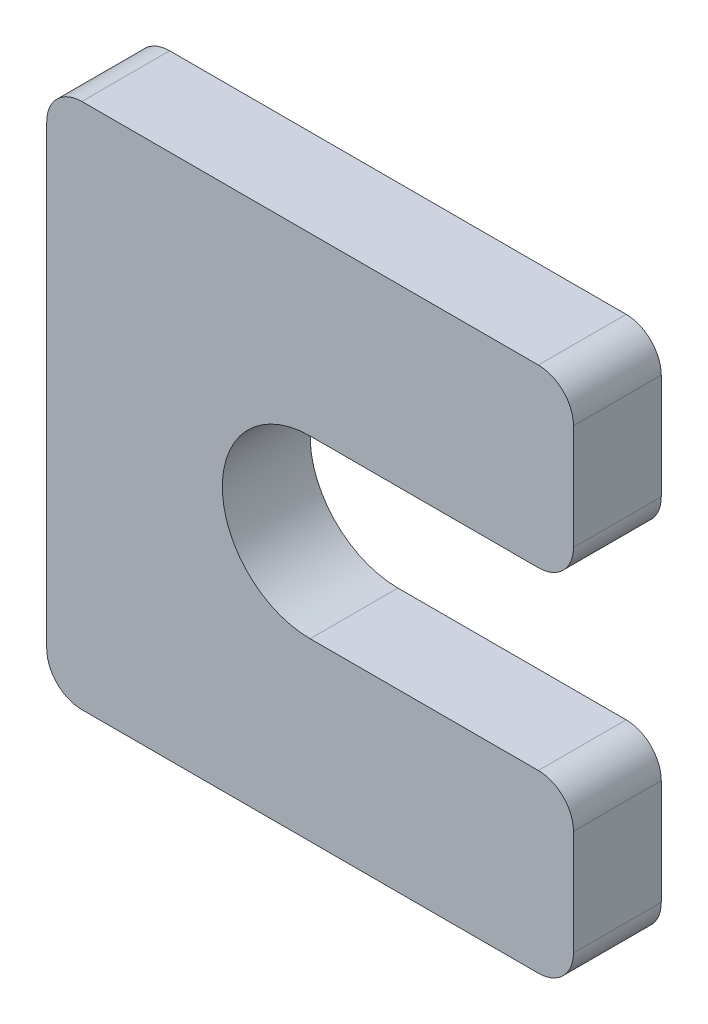
ISO-10303-21;
HEADER;
FILE_DESCRIPTION(('STEP AP214'),'2;1');
FILE_NAME('part.step','',(''),(''),'','','');
FILE_SCHEMA(('AUTOMOTIVE_DESIGN { 1 0 10303 214 1 1 1 1 }'));
ENDSEC;
DATA;
#1=APPLICATION_CONTEXT('core data for automotive mechanical design processes');
#2=APPLICATION_PROTOCOL_DEFINITION('international standard','automotive_design',2000,#1);
#3=PRODUCT_CONTEXT('',#1,'mechanical');
#4=PRODUCT('Part','Part','',(#3));
#5=PRODUCT_RELATED_PRODUCT_CATEGORY('part','',(#4));
#6=PRODUCT_DEFINITION_FORMATION('','',#4);
#7=PRODUCT_DEFINITION_CONTEXT('part definition',#1,'design');
#8=PRODUCT_DEFINITION('design','',#6,#7);
#9=PRODUCT_DEFINITION_SHAPE('','',#8);
#10=(LENGTH_UNIT() NAMED_UNIT(*) SI_UNIT(.MILLI.,.METRE.));
#11=(NAMED_UNIT(*) PLANE_ANGLE_UNIT() SI_UNIT($,.RADIAN.));
#12=(NAMED_UNIT(*) SI_UNIT($,.STERADIAN.) SOLID_ANGLE_UNIT());
#13=UNCERTAINTY_MEASURE_WITH_UNIT(LENGTH_MEASURE(1.E-05),#10,'distance_accuracy_value','');
#14=(GEOMETRIC_REPRESENTATION_CONTEXT(3) GLOBAL_UNCERTAINTY_ASSIGNED_CONTEXT((#13)) GLOBAL_UNIT_ASSIGNED_CONTEXT((#10,
#11,#12)) REPRESENTATION_CONTEXT('',''));
#15=CARTESIAN_POINT('',(0.,0.,0.));
#16=DIRECTION('',(0.,0.,1.));
#17=DIRECTION('',(1.,0.,0.));
#18=AXIS2_PLACEMENT_3D('',#15,#16,#17);
#19=CARTESIAN_POINT('',(30.,0.,5.));
#20=DIRECTION('',(-1.,0.,0.));
#21=DIRECTION('',(0.,0.,1.));
#22=AXIS2_PLACEMENT_3D('',#19,#20,#21);
#23=PLANE('',#22);
#24=DIRECTION('',(0.,1.,0.));
#25=VECTOR('',#24,1.);
#26=CARTESIAN_POINT('',(30.,0.,5.));
#27=LINE('',#26,#25);
#28=CARTESIAN_POINT('',(30.,22.,5.));
#29=VERTEX_POINT('',#28);
#30=CARTESIAN_POINT('',(30.,28.,5.));
#31=VERTEX_POINT('',#30);
#32=EDGE_CURVE('E175',#29,#31,#27,.T.);
#33=ORIENTED_EDGE('',*,*,#32,.F.);
#34=DIRECTION('',(0.,0.,1.));
#35=VECTOR('',#34,1.);
#36=CARTESIAN_POINT('',(30.,22.,5.));
#37=LINE('',#36,#35);
#38=CARTESIAN_POINT('',(30.,22.,0.));
#39=VERTEX_POINT('',#38);
#40=EDGE_CURVE('E55',#29,#39,#37,.F.);
#41=ORIENTED_EDGE('',*,*,#40,.T.);
#42=DIRECTION('',(0.,1.,0.));
#43=VECTOR('',#42,1.);
#44=CARTESIAN_POINT('',(30.,0.,0.));
#45=LINE('',#44,#43);
#46=CARTESIAN_POINT('',(30.,28.,0.));
#47=VERTEX_POINT('',#46);
#48=EDGE_CURVE('E188',#39,#47,#45,.T.);
#49=ORIENTED_EDGE('',*,*,#48,.T.);
#50=DIRECTION('',(0.,0.,-1.));
#51=VECTOR('',#50,1.);
#52=CARTESIAN_POINT('',(30.,28.,5.));
#53=LINE('',#52,#51);
#54=EDGE_CURVE('E223',#47,#31,#53,.F.);
#55=ORIENTED_EDGE('',*,*,#54,.T.);
#56=EDGE_LOOP('',(#33,#41,#49,#55));
#57=FACE_BOUND('',#56,.T.);
#58=ADVANCED_FACE('F33',(#57),#23,.F.);
#59=CARTESIAN_POINT('',(15.,15.,0.));
#60=DIRECTION('',(0.,0.,1.));
#61=DIRECTION('',(1.,0.,0.));
#62=AXIS2_PLACEMENT_3D('',#59,#60,#61);
#63=CYLINDRICAL_SURFACE('',#62,5.);
#64=DIRECTION('',(0.,0.,1.));
#65=VECTOR('',#64,1.);
#66=CARTESIAN_POINT('',(15.,20.,0.));
#67=LINE('',#66,#65);
#68=CARTESIAN_POINT('',(15.,20.,0.));
#69=VERTEX_POINT('',#68);
#70=CARTESIAN_POINT('',(15.,20.,5.00001125));
#71=VERTEX_POINT('',#70);
#72=EDGE_CURVE('E148',#69,#71,#67,.T.);
#73=ORIENTED_EDGE('',*,*,#72,.T.);
#74=CARTESIAN_POINT('',(15.,15.,5.));
#75=DIRECTION('',(0.,0.,-1.));
#76=DIRECTION('',(-1.,0.,0.));
#77=AXIS2_PLACEMENT_3D('',#74,#75,#76);
#78=CIRCLE('',#77,5.);
#79=CARTESIAN_POINT('',(15.,10.,5.00001125));
#80=VERTEX_POINT('',#79);
#81=EDGE_CURVE('E160',#80,#71,#78,.T.);
#82=ORIENTED_EDGE('',*,*,#81,.F.);
#83=DIRECTION('',(0.,0.,1.));
#84=VECTOR('',#83,1.);
#85=CARTESIAN_POINT('',(15.,10.,0.));
#86=LINE('',#85,#84);
#87=CARTESIAN_POINT('',(15.,10.,0.));
#88=VERTEX_POINT('',#87);
#89=EDGE_CURVE('E144',#88,#80,#86,.T.);
#90=ORIENTED_EDGE('',*,*,#89,.F.);
#91=CARTESIAN_POINT('',(15.,15.,0.));
#92=DIRECTION('',(0.,0.,1.));
#93=DIRECTION('',(1.,0.,0.));
#94=AXIS2_PLACEMENT_3D('',#91,#92,#93);
#95=CIRCLE('',#94,5.);
#96=EDGE_CURVE('E138',#69,#88,#95,.T.);
#97=ORIENTED_EDGE('',*,*,#96,.F.);
#98=EDGE_LOOP('',(#73,#82,#90,#97));
#99=FACE_BOUND('',#98,.T.);
#100=ADVANCED_FACE('F158',(#99),#63,.F.);
#101=CARTESIAN_POINT('',(0.,0.,5.));
#102=DIRECTION('',(1.,0.,0.));
#103=DIRECTION('',(0.,0.,-1.));
#104=AXIS2_PLACEMENT_3D('',#101,#102,#103);
#105=PLANE('',#104);
#106=DIRECTION('',(0.,-1.,0.));
#107=VECTOR('',#106,1.);
#108=CARTESIAN_POINT('',(0.,0.,0.));
#109=LINE('',#108,#107);
#110=CARTESIAN_POINT('',(0.,28.,0.));
#111=VERTEX_POINT('',#110);
#112=CARTESIAN_POINT('',(0.,2.,0.));
#113=VERTEX_POINT('',#112);
#114=EDGE_CURVE('E162',#111,#113,#109,.T.);
#115=ORIENTED_EDGE('',*,*,#114,.T.);
#116=DIRECTION('',(0.,0.,-1.));
#117=VECTOR('',#116,1.);
#118=CARTESIAN_POINT('',(0.,2.,5.));
#119=LINE('',#118,#117);
#120=CARTESIAN_POINT('',(0.,2.,5.));
#121=VERTEX_POINT('',#120);
#122=EDGE_CURVE('E11',#113,#121,#119,.F.);
#123=ORIENTED_EDGE('',*,*,#122,.T.);
#124=DIRECTION('',(0.,-1.,0.));
#125=VECTOR('',#124,1.);
#126=CARTESIAN_POINT('',(0.,0.,5.));
#127=LINE('',#126,#125);
#128=CARTESIAN_POINT('',(0.,28.,5.));
#129=VERTEX_POINT('',#128);
#130=EDGE_CURVE('E168',#129,#121,#127,.T.);
#131=ORIENTED_EDGE('',*,*,#130,.F.);
#132=DIRECTION('',(0.,0.,-1.));
#133=VECTOR('',#132,1.);
#134=CARTESIAN_POINT('',(0.,28.,5.));
#135=LINE('',#134,#133);
#136=EDGE_CURVE('E41',#129,#111,#135,.T.);
#137=ORIENTED_EDGE('',*,*,#136,.T.);
#138=EDGE_LOOP('',(#115,#123,#131,#137));
#139=FACE_BOUND('',#138,.T.);
#140=ADVANCED_FACE('F244',(#139),#105,.F.);
#141=CARTESIAN_POINT('',(0.,0.,5.));
#142=DIRECTION('',(0.,1.,0.));
#143=DIRECTION('',(0.,0.,1.));
#144=AXIS2_PLACEMENT_3D('',#141,#142,#143);
#145=PLANE('',#144);
#146=DIRECTION('',(1.,0.,0.));
#147=VECTOR('',#146,1.);
#148=CARTESIAN_POINT('',(0.,0.,0.));
#149=LINE('',#148,#147);
#150=CARTESIAN_POINT('',(2.,0.,0.));
#151=VERTEX_POINT('',#150);
#152=CARTESIAN_POINT('',(28.,0.,0.));
#153=VERTEX_POINT('',#152);
#154=EDGE_CURVE('E185',#151,#153,#149,.T.);
#155=ORIENTED_EDGE('',*,*,#154,.T.);
#156=DIRECTION('',(0.,0.,-1.));
#157=VECTOR('',#156,1.);
#158=CARTESIAN_POINT('',(28.,0.,5.));
#159=LINE('',#158,#157);
#160=CARTESIAN_POINT('',(28.,0.,5.));
#161=VERTEX_POINT('',#160);
#162=EDGE_CURVE('E238',#153,#161,#159,.F.);
#163=ORIENTED_EDGE('',*,*,#162,.T.);
#164=DIRECTION('',(1.,0.,0.));
#165=VECTOR('',#164,1.);
#166=CARTESIAN_POINT('',(0.,0.,5.));
#167=LINE('',#166,#165);
#168=CARTESIAN_POINT('',(2.,0.,5.));
#169=VERTEX_POINT('',#168);
#170=EDGE_CURVE('E171',#169,#161,#167,.T.);
#171=ORIENTED_EDGE('',*,*,#170,.F.);
#172=DIRECTION('',(0.,0.,-1.));
#173=VECTOR('',#172,1.);
#174=CARTESIAN_POINT('',(2.,0.,5.));
#175=LINE('',#174,#173);
#176=EDGE_CURVE('E235',#169,#151,#175,.T.);
#177=ORIENTED_EDGE('',*,*,#176,.T.);
#178=EDGE_LOOP('',(#155,#163,#171,#177));
#179=FACE_BOUND('',#178,.T.);
#180=ADVANCED_FACE('F302',(#179),#145,.F.);
#181=CARTESIAN_POINT('',(30.,2.,0.));
#182=VERTEX_POINT('',#181);
#183=CARTESIAN_POINT('',(30.,8.,0.));
#184=VERTEX_POINT('',#183);
#185=EDGE_CURVE('E190',#182,#184,#45,.T.);
#186=ORIENTED_EDGE('',*,*,#185,.T.);
#187=DIRECTION('',(0.,0.,1.));
#188=VECTOR('',#187,1.);
#189=CARTESIAN_POINT('',(30.,8.,5.));
#190=LINE('',#189,#188);
#191=CARTESIAN_POINT('',(30.,8.,5.));
#192=VERTEX_POINT('',#191);
#193=EDGE_CURVE('E197',#184,#192,#190,.T.);
#194=ORIENTED_EDGE('',*,*,#193,.T.);
#195=CARTESIAN_POINT('',(30.,2.,5.));
#196=VERTEX_POINT('',#195);
#197=EDGE_CURVE('E178',#196,#192,#27,.T.);
#198=ORIENTED_EDGE('',*,*,#197,.F.);
#199=DIRECTION('',(0.,0.,-1.));
#200=VECTOR('',#199,1.);
#201=CARTESIAN_POINT('',(30.,2.,5.));
#202=LINE('',#201,#200);
#203=EDGE_CURVE('E182',#196,#182,#202,.T.);
#204=ORIENTED_EDGE('',*,*,#203,.T.);
#205=EDGE_LOOP('',(#186,#194,#198,#204));
#206=FACE_BOUND('',#205,.T.);
#207=ADVANCED_FACE('F294',(#206),#23,.F.);
#208=CARTESIAN_POINT('',(0.,30.,5.));
#209=DIRECTION('',(0.,-1.,0.));
#210=DIRECTION('',(0.,0.,-1.));
#211=AXIS2_PLACEMENT_3D('',#208,#209,#210);
#212=PLANE('',#211);
#213=DIRECTION('',(-1.,0.,0.));
#214=VECTOR('',#213,1.);
#215=CARTESIAN_POINT('',(0.,30.,5.));
#216=LINE('',#215,#214);
#217=CARTESIAN_POINT('',(28.,30.,5.));
#218=VERTEX_POINT('',#217);
#219=CARTESIAN_POINT('',(2.,30.,5.));
#220=VERTEX_POINT('',#219);
#221=EDGE_CURVE('E179',#218,#220,#216,.T.);
#222=ORIENTED_EDGE('',*,*,#221,.F.);
#223=DIRECTION('',(0.,0.,-1.));
#224=VECTOR('',#223,1.);
#225=CARTESIAN_POINT('',(28.,30.,5.));
#226=LINE('',#225,#224);
#227=CARTESIAN_POINT('',(28.,30.,0.));
#228=VERTEX_POINT('',#227);
#229=EDGE_CURVE('E232',#218,#228,#226,.T.);
#230=ORIENTED_EDGE('',*,*,#229,.T.);
#231=DIRECTION('',(-1.,0.,0.));
#232=VECTOR('',#231,1.);
#233=CARTESIAN_POINT('',(0.,30.,0.));
#234=LINE('',#233,#232);
#235=CARTESIAN_POINT('',(2.,30.,0.));
#236=VERTEX_POINT('',#235);
#237=EDGE_CURVE('E172',#228,#236,#234,.T.);
#238=ORIENTED_EDGE('',*,*,#237,.T.);
#239=DIRECTION('',(0.,0.,-1.));
#240=VECTOR('',#239,1.);
#241=CARTESIAN_POINT('',(2.,30.,5.));
#242=LINE('',#241,#240);
#243=EDGE_CURVE('E230',#236,#220,#242,.F.);
#244=ORIENTED_EDGE('',*,*,#243,.T.);
#245=EDGE_LOOP('',(#222,#230,#238,#244));
#246=FACE_BOUND('',#245,.T.);
#247=ADVANCED_FACE('F275',(#246),#212,.F.);
#248=CARTESIAN_POINT('',(0.,0.,5.));
#249=DIRECTION('',(0.,0.,-1.));
#250=DIRECTION('',(-1.,0.,0.));
#251=AXIS2_PLACEMENT_3D('',#248,#249,#250);
#252=PLANE('',#251);
#253=ORIENTED_EDGE('',*,*,#197,.T.);
#254=CARTESIAN_POINT('',(28.,8.,5.));
#255=DIRECTION('',(0.,0.,-1.));
#256=DIRECTION('',(-1.,0.,0.));
#257=AXIS2_PLACEMENT_3D('',#254,#255,#256);
#258=CIRCLE('',#257,2.);
#259=CARTESIAN_POINT('',(28.,10.,5.));
#260=VERTEX_POINT('',#259);
#261=EDGE_CURVE('E259',#192,#260,#258,.F.);
#262=ORIENTED_EDGE('',*,*,#261,.T.);
#263=DIRECTION('',(-1.,0.,0.));
#264=VECTOR('',#263,1.);
#265=CARTESIAN_POINT('',(0.,10.,5.));
#266=LINE('',#265,#264);
#267=EDGE_CURVE('E155',#260,#80,#266,.T.);
#268=ORIENTED_EDGE('',*,*,#267,.T.);
#269=ORIENTED_EDGE('',*,*,#81,.T.);
#270=DIRECTION('',(1.,0.,0.));
#271=VECTOR('',#270,1.);
#272=CARTESIAN_POINT('',(0.,20.,5.));
#273=LINE('',#272,#271);
#274=CARTESIAN_POINT('',(28.,20.,5.));
#275=VERTEX_POINT('',#274);
#276=EDGE_CURVE('E151',#71,#275,#273,.T.);
#277=ORIENTED_EDGE('',*,*,#276,.T.);
#278=CARTESIAN_POINT('',(28.,22.,5.));
#279=DIRECTION('',(0.,0.,-1.));
#280=DIRECTION('',(-1.,0.,0.));
#281=AXIS2_PLACEMENT_3D('',#278,#279,#280);
#282=CIRCLE('',#281,2.);
#283=EDGE_CURVE('E261',#275,#29,#282,.F.);
#284=ORIENTED_EDGE('',*,*,#283,.T.);
#285=ORIENTED_EDGE('',*,*,#32,.T.);
#286=CARTESIAN_POINT('',(28.,28.,5.));
#287=DIRECTION('',(0.,0.,-1.));
#288=DIRECTION('',(-1.,0.,0.));
#289=AXIS2_PLACEMENT_3D('',#286,#287,#288);
#290=CIRCLE('',#289,2.);
#291=EDGE_CURVE('E263',#31,#218,#290,.F.);
#292=ORIENTED_EDGE('',*,*,#291,.T.);
#293=ORIENTED_EDGE('',*,*,#221,.T.);
#294=CARTESIAN_POINT('',(2.,28.,5.));
#295=DIRECTION('',(0.,0.,-1.));
#296=DIRECTION('',(-1.,0.,0.));
#297=AXIS2_PLACEMENT_3D('',#294,#295,#296);
#298=CIRCLE('',#297,2.);
#299=EDGE_CURVE('E200',#220,#129,#298,.F.);
#300=ORIENTED_EDGE('',*,*,#299,.T.);
#301=ORIENTED_EDGE('',*,*,#130,.T.);
#302=CARTESIAN_POINT('',(2.,2.,5.));
#303=DIRECTION('',(0.,0.,-1.));
#304=DIRECTION('',(-1.,0.,0.));
#305=AXIS2_PLACEMENT_3D('',#302,#303,#304);
#306=CIRCLE('',#305,2.);
#307=EDGE_CURVE('E266',#121,#169,#306,.F.);
#308=ORIENTED_EDGE('',*,*,#307,.T.);
#309=ORIENTED_EDGE('',*,*,#170,.T.);
#310=CARTESIAN_POINT('',(28.,2.,5.));
#311=DIRECTION('',(0.,0.,-1.));
#312=DIRECTION('',(-1.,0.,0.));
#313=AXIS2_PLACEMENT_3D('',#310,#311,#312);
#314=CIRCLE('',#313,2.);
#315=EDGE_CURVE('E265',#161,#196,#314,.F.);
#316=ORIENTED_EDGE('',*,*,#315,.T.);
#317=EDGE_LOOP('',(#253,#262,#268,#269,#277,#284,#285,#292,#293,#300,#301,#308,#309,#316));
#318=FACE_BOUND('',#317,.T.);
#319=ADVANCED_FACE('F271',(#318),#252,.F.);
#320=CARTESIAN_POINT('',(0.,0.,0.));
#321=DIRECTION('',(0.,0.,-1.));
#322=DIRECTION('',(-1.,0.,0.));
#323=AXIS2_PLACEMENT_3D('',#320,#321,#322);
#324=PLANE('',#323);
#325=DIRECTION('',(1.,0.,0.));
#326=VECTOR('',#325,1.);
#327=CARTESIAN_POINT('',(15.,10.,0.));
#328=LINE('',#327,#326);
#329=CARTESIAN_POINT('',(28.,10.,0.));
#330=VERTEX_POINT('',#329);
#331=EDGE_CURVE('E145',#88,#330,#328,.T.);
#332=ORIENTED_EDGE('',*,*,#331,.T.);
#333=CARTESIAN_POINT('',(28.,8.,0.));
#334=DIRECTION('',(0.,0.,-1.));
#335=DIRECTION('',(-1.,0.,0.));
#336=AXIS2_PLACEMENT_3D('',#333,#334,#335);
#337=CIRCLE('',#336,2.);
#338=EDGE_CURVE('E213',#330,#184,#337,.T.);
#339=ORIENTED_EDGE('',*,*,#338,.T.);
#340=ORIENTED_EDGE('',*,*,#185,.F.);
#341=CARTESIAN_POINT('',(28.,2.,0.));
#342=DIRECTION('',(0.,0.,-1.));
#343=DIRECTION('',(-1.,0.,0.));
#344=AXIS2_PLACEMENT_3D('',#341,#342,#343);
#345=CIRCLE('',#344,2.);
#346=EDGE_CURVE('E253',#182,#153,#345,.T.);
#347=ORIENTED_EDGE('',*,*,#346,.T.);
#348=ORIENTED_EDGE('',*,*,#154,.F.);
#349=CARTESIAN_POINT('',(2.,2.,0.));
#350=DIRECTION('',(0.,0.,-1.));
#351=DIRECTION('',(-1.,0.,0.));
#352=AXIS2_PLACEMENT_3D('',#349,#350,#351);
#353=CIRCLE('',#352,2.);
#354=EDGE_CURVE('E250',#151,#113,#353,.T.);
#355=ORIENTED_EDGE('',*,*,#354,.T.);
#356=ORIENTED_EDGE('',*,*,#114,.F.);
#357=CARTESIAN_POINT('',(2.,28.,0.));
#358=DIRECTION('',(0.,0.,-1.));
#359=DIRECTION('',(-1.,0.,0.));
#360=AXIS2_PLACEMENT_3D('',#357,#358,#359);
#361=CIRCLE('',#360,2.);
#362=EDGE_CURVE('E248',#111,#236,#361,.T.);
#363=ORIENTED_EDGE('',*,*,#362,.T.);
#364=ORIENTED_EDGE('',*,*,#237,.F.);
#365=CARTESIAN_POINT('',(28.,28.,0.));
#366=DIRECTION('',(0.,0.,-1.));
#367=DIRECTION('',(-1.,0.,0.));
#368=AXIS2_PLACEMENT_3D('',#365,#366,#367);
#369=CIRCLE('',#368,2.);
#370=EDGE_CURVE('E48',#228,#47,#369,.T.);
#371=ORIENTED_EDGE('',*,*,#370,.T.);
#372=ORIENTED_EDGE('',*,*,#48,.F.);
#373=CARTESIAN_POINT('',(28.,22.,0.));
#374=DIRECTION('',(0.,0.,-1.));
#375=DIRECTION('',(-1.,0.,0.));
#376=AXIS2_PLACEMENT_3D('',#373,#374,#375);
#377=CIRCLE('',#376,2.);
#378=CARTESIAN_POINT('',(28.,20.,0.));
#379=VERTEX_POINT('',#378);
#380=EDGE_CURVE('E140',#39,#379,#377,.T.);
#381=ORIENTED_EDGE('',*,*,#380,.T.);
#382=DIRECTION('',(-1.,0.,0.));
#383=VECTOR('',#382,1.);
#384=CARTESIAN_POINT('',(30.,20.,0.));
#385=LINE('',#384,#383);
#386=EDGE_CURVE('E133',#379,#69,#385,.T.);
#387=ORIENTED_EDGE('',*,*,#386,.T.);
#388=ORIENTED_EDGE('',*,*,#96,.T.);
#389=EDGE_LOOP('',(#332,#339,#340,#347,#348,#355,#356,#363,#364,#371,#372,#381,#387,#388));
#390=FACE_BOUND('',#389,.T.);
#391=ADVANCED_FACE('F136',(#390),#324,.T.);
#392=CARTESIAN_POINT('',(15.,10.,0.));
#393=DIRECTION('',(0.,-1.,0.));
#394=DIRECTION('',(0.,0.,-1.));
#395=AXIS2_PLACEMENT_3D('',#392,#393,#394);
#396=PLANE('',#395);
#397=ORIENTED_EDGE('',*,*,#267,.F.);
#398=DIRECTION('',(0.,0.,1.));
#399=VECTOR('',#398,1.);
#400=CARTESIAN_POINT('',(28.,10.,0.));
#401=LINE('',#400,#399);
#402=EDGE_CURVE('E220',#260,#330,#401,.F.);
#403=ORIENTED_EDGE('',*,*,#402,.T.);
#404=ORIENTED_EDGE('',*,*,#331,.F.);
#405=ORIENTED_EDGE('',*,*,#89,.T.);
#406=EDGE_LOOP('',(#397,#403,#404,#405));
#407=FACE_BOUND('',#406,.T.);
#408=ADVANCED_FACE('F346',(#407),#396,.F.);
#409=CARTESIAN_POINT('',(30.,20.,0.));
#410=DIRECTION('',(0.,1.,0.));
#411=DIRECTION('',(0.,0.,1.));
#412=AXIS2_PLACEMENT_3D('',#409,#410,#411);
#413=PLANE('',#412);
#414=ORIENTED_EDGE('',*,*,#386,.F.);
#415=DIRECTION('',(0.,0.,1.));
#416=VECTOR('',#415,1.);
#417=CARTESIAN_POINT('',(28.,20.,0.));
#418=LINE('',#417,#416);
#419=EDGE_CURVE('E221',#379,#275,#418,.T.);
#420=ORIENTED_EDGE('',*,*,#419,.T.);
#421=ORIENTED_EDGE('',*,*,#276,.F.);
#422=ORIENTED_EDGE('',*,*,#72,.F.);
#423=EDGE_LOOP('',(#414,#420,#421,#422));
#424=FACE_BOUND('',#423,.T.);
#425=ADVANCED_FACE('F149',(#424),#413,.F.);
#426=CARTESIAN_POINT('',(28.,8.,5.));
#427=DIRECTION('',(0.,0.,1.));
#428=DIRECTION('',(1.,0.,0.));
#429=AXIS2_PLACEMENT_3D('',#426,#427,#428);
#430=CYLINDRICAL_SURFACE('',#429,2.);
#431=ORIENTED_EDGE('',*,*,#338,.F.);
#432=ORIENTED_EDGE('',*,*,#402,.F.);
#433=ORIENTED_EDGE('',*,*,#261,.F.);
#434=ORIENTED_EDGE('',*,*,#193,.F.);
#435=EDGE_LOOP('',(#431,#432,#433,#434));
#436=FACE_BOUND('',#435,.T.);
#437=ADVANCED_FACE('F219',(#436),#430,.T.);
#438=CARTESIAN_POINT('',(28.,22.,0.));
#439=DIRECTION('',(0.,0.,1.));
#440=DIRECTION('',(1.,0.,0.));
#441=AXIS2_PLACEMENT_3D('',#438,#439,#440);
#442=CYLINDRICAL_SURFACE('',#441,2.);
#443=ORIENTED_EDGE('',*,*,#380,.F.);
#444=ORIENTED_EDGE('',*,*,#40,.F.);
#445=ORIENTED_EDGE('',*,*,#283,.F.);
#446=ORIENTED_EDGE('',*,*,#419,.F.);
#447=EDGE_LOOP('',(#443,#444,#445,#446));
#448=FACE_BOUND('',#447,.T.);
#449=ADVANCED_FACE('F282',(#448),#442,.T.);
#450=CARTESIAN_POINT('',(28.,28.,5.));
#451=DIRECTION('',(0.,0.,-1.));
#452=DIRECTION('',(-1.,0.,0.));
#453=AXIS2_PLACEMENT_3D('',#450,#451,#452);
#454=CYLINDRICAL_SURFACE('',#453,2.);
#455=ORIENTED_EDGE('',*,*,#291,.F.);
#456=ORIENTED_EDGE('',*,*,#54,.F.);
#457=ORIENTED_EDGE('',*,*,#370,.F.);
#458=ORIENTED_EDGE('',*,*,#229,.F.);
#459=EDGE_LOOP('',(#455,#456,#457,#458));
#460=FACE_BOUND('',#459,.T.);
#461=ADVANCED_FACE('F279',(#460),#454,.T.);
#462=CARTESIAN_POINT('',(28.,2.,5.));
#463=DIRECTION('',(0.,0.,-1.));
#464=DIRECTION('',(-1.,0.,0.));
#465=AXIS2_PLACEMENT_3D('',#462,#463,#464);
#466=CYLINDRICAL_SURFACE('',#465,2.);
#467=ORIENTED_EDGE('',*,*,#315,.F.);
#468=ORIENTED_EDGE('',*,*,#162,.F.);
#469=ORIENTED_EDGE('',*,*,#346,.F.);
#470=ORIENTED_EDGE('',*,*,#203,.F.);
#471=EDGE_LOOP('',(#467,#468,#469,#470));
#472=FACE_BOUND('',#471,.T.);
#473=ADVANCED_FACE('F289',(#472),#466,.T.);
#474=CARTESIAN_POINT('',(2.,2.,5.));
#475=DIRECTION('',(0.,0.,-1.));
#476=DIRECTION('',(-1.,0.,0.));
#477=AXIS2_PLACEMENT_3D('',#474,#475,#476);
#478=CYLINDRICAL_SURFACE('',#477,2.);
#479=ORIENTED_EDGE('',*,*,#307,.F.);
#480=ORIENTED_EDGE('',*,*,#122,.F.);
#481=ORIENTED_EDGE('',*,*,#354,.F.);
#482=ORIENTED_EDGE('',*,*,#176,.F.);
#483=EDGE_LOOP('',(#479,#480,#481,#482));
#484=FACE_BOUND('',#483,.T.);
#485=ADVANCED_FACE('F314',(#484),#478,.T.);
#486=CARTESIAN_POINT('',(2.,28.,5.));
#487=DIRECTION('',(0.,0.,-1.));
#488=DIRECTION('',(-1.,0.,0.));
#489=AXIS2_PLACEMENT_3D('',#486,#487,#488);
#490=CYLINDRICAL_SURFACE('',#489,2.);
#491=ORIENTED_EDGE('',*,*,#299,.F.);
#492=ORIENTED_EDGE('',*,*,#243,.F.);
#493=ORIENTED_EDGE('',*,*,#362,.F.);
#494=ORIENTED_EDGE('',*,*,#136,.F.);
#495=EDGE_LOOP('',(#491,#492,#493,#494));
#496=FACE_BOUND('',#495,.T.);
#497=ADVANCED_FACE('F35',(#496),#490,.T.);
#498=CLOSED_SHELL('',(#58,#100,#140,#180,#207,#247,#319,#391,#408,#425,#437,#449,#461,#473,#485,#497));
#499=MANIFOLD_SOLID_BREP('B2',#498);
#500=ADVANCED_BREP_SHAPE_REPRESENTATION('',(#18,#499),#14);
#501=SHAPE_DEFINITION_REPRESENTATION(#9,#500);
ENDSEC;
END-ISO-10303-21;
